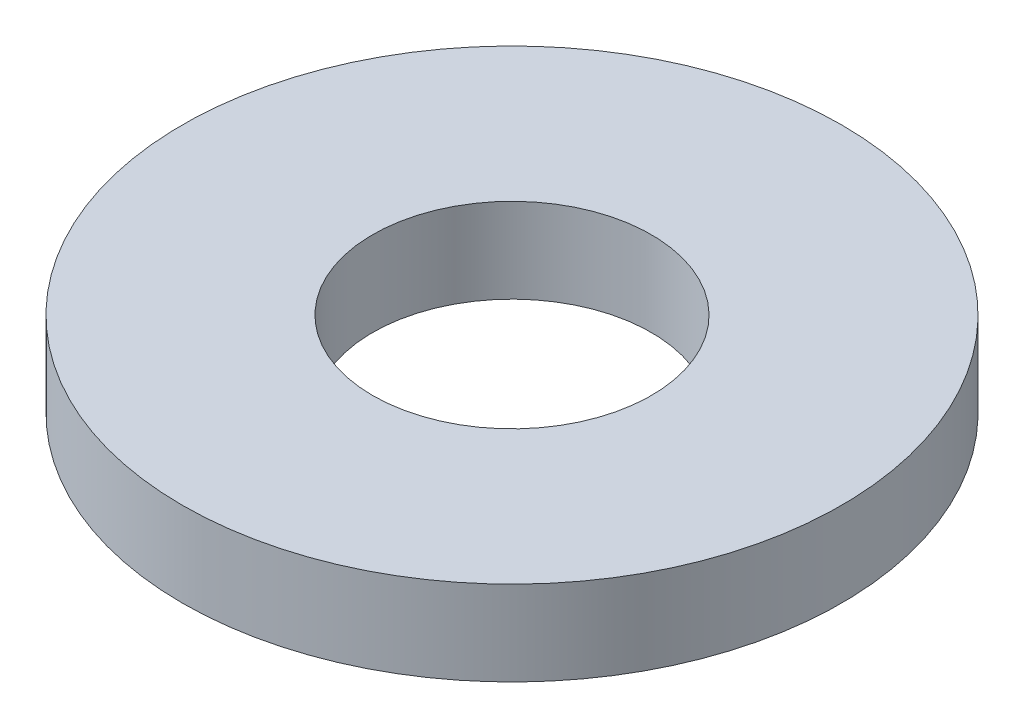
ISO-10303-21;
HEADER;
FILE_DESCRIPTION(('STEP AP214'),'2;1');
FILE_NAME('part.step','',(''),(''),'','','');
FILE_SCHEMA(('AUTOMOTIVE_DESIGN { 1 0 10303 214 1 1 1 1 }'));
ENDSEC;
DATA;
#1=APPLICATION_CONTEXT('core data for automotive mechanical design processes');
#2=APPLICATION_PROTOCOL_DEFINITION('international standard','automotive_design',2000,#1);
#3=PRODUCT_CONTEXT('',#1,'mechanical');
#4=PRODUCT('Part','Part','',(#3));
#5=PRODUCT_RELATED_PRODUCT_CATEGORY('part','',(#4));
#6=PRODUCT_DEFINITION_FORMATION('','',#4);
#7=PRODUCT_DEFINITION_CONTEXT('part definition',#1,'design');
#8=PRODUCT_DEFINITION('design','',#6,#7);
#9=PRODUCT_DEFINITION_SHAPE('','',#8);
#10=(LENGTH_UNIT() NAMED_UNIT(*) SI_UNIT(.MILLI.,.METRE.));
#11=(NAMED_UNIT(*) PLANE_ANGLE_UNIT() SI_UNIT($,.RADIAN.));
#12=(NAMED_UNIT(*) SI_UNIT($,.STERADIAN.) SOLID_ANGLE_UNIT());
#13=UNCERTAINTY_MEASURE_WITH_UNIT(LENGTH_MEASURE(1.E-05),#10,'distance_accuracy_value','');
#14=(GEOMETRIC_REPRESENTATION_CONTEXT(3) GLOBAL_UNCERTAINTY_ASSIGNED_CONTEXT((#13)) GLOBAL_UNIT_ASSIGNED_CONTEXT((#10,
#11,#12)) REPRESENTATION_CONTEXT('',''));
#15=CARTESIAN_POINT('',(0.,0.,0.));
#16=DIRECTION('',(0.,0.,1.));
#17=DIRECTION('',(1.,0.,0.));
#18=AXIS2_PLACEMENT_3D('',#15,#16,#17);
#19=CARTESIAN_POINT('',(0.,9.,0.));
#20=DIRECTION('',(0.,1.,0.));
#21=DIRECTION('',(0.,0.,1.));
#22=AXIS2_PLACEMENT_3D('',#19,#20,#21);
#23=PLANE('',#22);
#24=CARTESIAN_POINT('',(0.,9.,0.));
#25=DIRECTION('',(0.,1.,0.));
#26=DIRECTION('',(0.,0.,1.));
#27=AXIS2_PLACEMENT_3D('',#24,#25,#26);
#28=CIRCLE('',#27,35.);
#29=CARTESIAN_POINT('',(0.,9.,35.));
#30=VERTEX_POINT('',#29);
#31=EDGE_CURVE('E10',#30,#30,#28,.T.);
#32=ORIENTED_EDGE('',*,*,#31,.T.);
#33=EDGE_LOOP('',(#32));
#34=FACE_BOUND('',#33,.T.);
#35=CARTESIAN_POINT('',(0.,9.,0.));
#36=DIRECTION('',(0.,1.,0.));
#37=DIRECTION('',(0.,0.,1.));
#38=AXIS2_PLACEMENT_3D('',#35,#36,#37);
#39=CIRCLE('',#38,14.8);
#40=CARTESIAN_POINT('',(0.,9.,14.8));
#41=VERTEX_POINT('',#40);
#42=EDGE_CURVE('E41',#41,#41,#39,.T.);
#43=ORIENTED_EDGE('',*,*,#42,.F.);
#44=EDGE_LOOP('',(#43));
#45=FACE_BOUND('',#44,.T.);
#46=ADVANCED_FACE('F30',(#34,#45),#23,.T.);
#47=CARTESIAN_POINT('',(0.,0.,0.));
#48=DIRECTION('',(0.,1.,0.));
#49=DIRECTION('',(0.,0.,1.));
#50=AXIS2_PLACEMENT_3D('',#47,#48,#49);
#51=PLANE('',#50);
#52=CARTESIAN_POINT('',(0.,0.,0.));
#53=DIRECTION('',(0.,1.,0.));
#54=DIRECTION('',(0.,0.,1.));
#55=AXIS2_PLACEMENT_3D('',#52,#53,#54);
#56=CIRCLE('',#55,35.);
#57=CARTESIAN_POINT('',(0.,0.,35.));
#58=VERTEX_POINT('',#57);
#59=EDGE_CURVE('E34',#58,#58,#56,.T.);
#60=ORIENTED_EDGE('',*,*,#59,.F.);
#61=EDGE_LOOP('',(#60));
#62=FACE_BOUND('',#61,.T.);
#63=CARTESIAN_POINT('',(0.,0.,0.));
#64=DIRECTION('',(0.,1.,0.));
#65=DIRECTION('',(0.,0.,1.));
#66=AXIS2_PLACEMENT_3D('',#63,#64,#65);
#67=CIRCLE('',#66,14.8);
#68=CARTESIAN_POINT('',(0.,0.,14.8));
#69=VERTEX_POINT('',#68);
#70=EDGE_CURVE('E43',#69,#69,#67,.T.);
#71=ORIENTED_EDGE('',*,*,#70,.T.);
#72=EDGE_LOOP('',(#71));
#73=FACE_BOUND('',#72,.T.);
#74=ADVANCED_FACE('F53',(#62,#73),#51,.F.);
#75=CARTESIAN_POINT('',(0.,9.,0.));
#76=DIRECTION('',(0.,-1.,0.));
#77=DIRECTION('',(0.,0.,-1.));
#78=AXIS2_PLACEMENT_3D('',#75,#76,#77);
#79=CYLINDRICAL_SURFACE('',#78,35.);
#80=ORIENTED_EDGE('',*,*,#31,.F.);
#81=EDGE_LOOP('',(#80));
#82=FACE_BOUND('',#81,.T.);
#83=ORIENTED_EDGE('',*,*,#59,.T.);
#84=EDGE_LOOP('',(#83));
#85=FACE_BOUND('',#84,.T.);
#86=ADVANCED_FACE('F32',(#82,#85),#79,.T.);
#87=CARTESIAN_POINT('',(0.,9.,0.));
#88=DIRECTION('',(0.,-1.,0.));
#89=DIRECTION('',(0.,0.,-1.));
#90=AXIS2_PLACEMENT_3D('',#87,#88,#89);
#91=CYLINDRICAL_SURFACE('',#90,14.8);
#92=ORIENTED_EDGE('',*,*,#42,.T.);
#93=EDGE_LOOP('',(#92));
#94=FACE_BOUND('',#93,.T.);
#95=ORIENTED_EDGE('',*,*,#70,.F.);
#96=EDGE_LOOP('',(#95));
#97=FACE_BOUND('',#96,.T.);
#98=ADVANCED_FACE('F49',(#94,#97),#91,.F.);
#99=CLOSED_SHELL('',(#46,#74,#86,#98));
#100=MANIFOLD_SOLID_BREP('B2',#99);
#101=ADVANCED_BREP_SHAPE_REPRESENTATION('',(#18,#100),#14);
#102=SHAPE_DEFINITION_REPRESENTATION(#9,#101);
ENDSEC;
END-ISO-10303-21;
